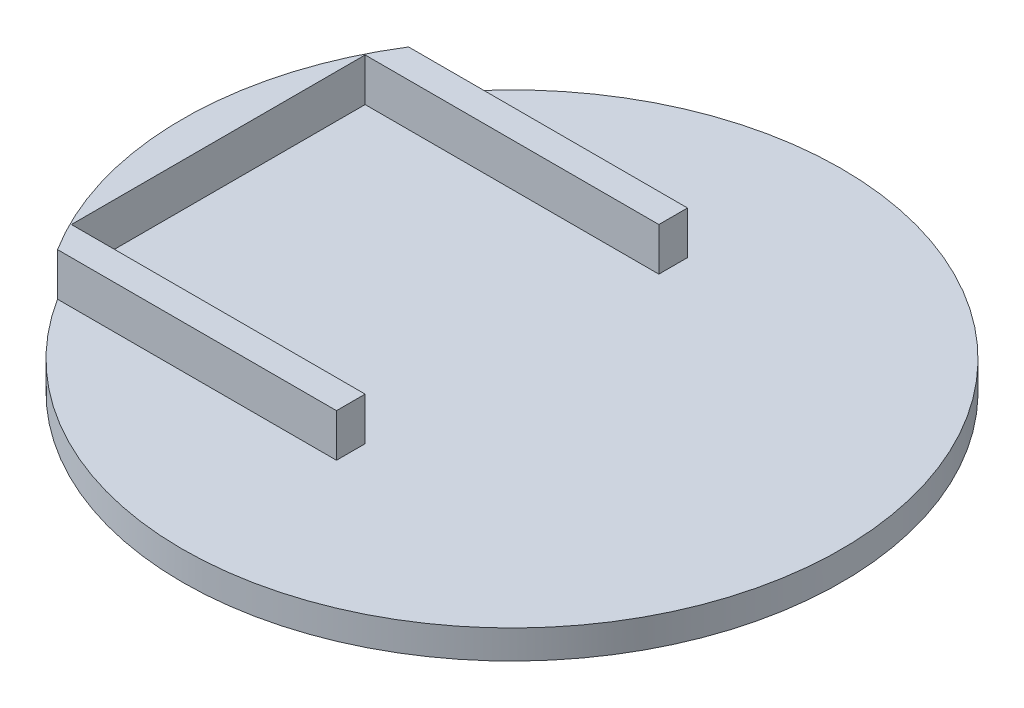
ISO-10303-21;
HEADER;
FILE_DESCRIPTION(('STEP AP214'),'2;1');
FILE_NAME('part.step','',(''),(''),'','','');
FILE_SCHEMA(('AUTOMOTIVE_DESIGN { 1 0 10303 214 1 1 1 1 }'));
ENDSEC;
DATA;
#1=APPLICATION_CONTEXT('core data for automotive mechanical design processes');
#2=APPLICATION_PROTOCOL_DEFINITION('international standard','automotive_design',2000,#1);
#3=PRODUCT_CONTEXT('',#1,'mechanical');
#4=PRODUCT('Part','Part','',(#3));
#5=PRODUCT_RELATED_PRODUCT_CATEGORY('part','',(#4));
#6=PRODUCT_DEFINITION_FORMATION('','',#4);
#7=PRODUCT_DEFINITION_CONTEXT('part definition',#1,'design');
#8=PRODUCT_DEFINITION('design','',#6,#7);
#9=PRODUCT_DEFINITION_SHAPE('','',#8);
#10=(LENGTH_UNIT() NAMED_UNIT(*) SI_UNIT(.MILLI.,.METRE.));
#11=(NAMED_UNIT(*) PLANE_ANGLE_UNIT() SI_UNIT($,.RADIAN.));
#12=(NAMED_UNIT(*) SI_UNIT($,.STERADIAN.) SOLID_ANGLE_UNIT());
#13=UNCERTAINTY_MEASURE_WITH_UNIT(LENGTH_MEASURE(1.E-05),#10,'distance_accuracy_value','');
#14=(GEOMETRIC_REPRESENTATION_CONTEXT(3) GLOBAL_UNCERTAINTY_ASSIGNED_CONTEXT((#13)) GLOBAL_UNIT_ASSIGNED_CONTEXT((#10,
#11,#12)) REPRESENTATION_CONTEXT('',''));
#15=CARTESIAN_POINT('',(0.,0.,0.));
#16=DIRECTION('',(0.,0.,1.));
#17=DIRECTION('',(1.,0.,0.));
#18=AXIS2_PLACEMENT_3D('',#15,#16,#17);
#19=CARTESIAN_POINT('',(0.,2.,0.));
#20=DIRECTION('',(0.,1.,0.));
#21=DIRECTION('',(0.,0.,1.));
#22=AXIS2_PLACEMENT_3D('',#19,#20,#21);
#23=PLANE('',#22);
#24=CARTESIAN_POINT('',(0.,2.,0.));
#25=DIRECTION('',(0.,1.,0.));
#26=DIRECTION('',(0.,0.,1.));
#27=AXIS2_PLACEMENT_3D('',#24,#25,#26);
#28=CIRCLE('',#27,23.);
#29=CARTESIAN_POINT('',(-19.4663170630708,2.,12.25));
#30=VERTEX_POINT('',#29);
#31=CARTESIAN_POINT('',(-19.4663170630708,2.,-12.25));
#32=VERTEX_POINT('',#31);
#33=EDGE_CURVE('E11',#30,#32,#28,.T.);
#34=ORIENTED_EDGE('',*,*,#33,.T.);
#35=DIRECTION('',(1.,0.,0.));
#36=VECTOR('',#35,1.);
#37=CARTESIAN_POINT('',(0.,2.,-12.25));
#38=LINE('',#37,#36);
#39=CARTESIAN_POINT('',(0.,2.,-12.25));
#40=VERTEX_POINT('',#39);
#41=EDGE_CURVE('E132',#32,#40,#38,.T.);
#42=ORIENTED_EDGE('',*,*,#41,.T.);
#43=DIRECTION('',(0.,0.,1.));
#44=VECTOR('',#43,1.);
#45=CARTESIAN_POINT('',(0.,2.,0.));
#46=LINE('',#45,#44);
#47=CARTESIAN_POINT('',(0.,2.,-10.25));
#48=VERTEX_POINT('',#47);
#49=EDGE_CURVE('E135',#40,#48,#46,.T.);
#50=ORIENTED_EDGE('',*,*,#49,.T.);
#51=DIRECTION('',(-1.,0.,0.));
#52=VECTOR('',#51,1.);
#53=CARTESIAN_POINT('',(0.,2.,-10.25));
#54=LINE('',#53,#52);
#55=CARTESIAN_POINT('',(-20.5,2.,-10.25));
#56=VERTEX_POINT('',#55);
#57=EDGE_CURVE('E138',#48,#56,#54,.T.);
#58=ORIENTED_EDGE('',*,*,#57,.T.);
#59=DIRECTION('',(0.,0.,1.));
#60=VECTOR('',#59,1.);
#61=CARTESIAN_POINT('',(-20.5,2.,0.));
#62=LINE('',#61,#60);
#63=CARTESIAN_POINT('',(-20.5,2.,10.25));
#64=VERTEX_POINT('',#63);
#65=EDGE_CURVE('E56',#56,#64,#62,.T.);
#66=ORIENTED_EDGE('',*,*,#65,.T.);
#67=DIRECTION('',(1.,0.,0.));
#68=VECTOR('',#67,1.);
#69=CARTESIAN_POINT('',(0.,2.,10.25));
#70=LINE('',#69,#68);
#71=CARTESIAN_POINT('',(0.,2.,10.25));
#72=VERTEX_POINT('',#71);
#73=EDGE_CURVE('E118',#64,#72,#70,.T.);
#74=ORIENTED_EDGE('',*,*,#73,.T.);
#75=DIRECTION('',(0.,0.,1.));
#76=VECTOR('',#75,1.);
#77=CARTESIAN_POINT('',(0.,2.,0.));
#78=LINE('',#77,#76);
#79=CARTESIAN_POINT('',(0.,2.,12.25));
#80=VERTEX_POINT('',#79);
#81=EDGE_CURVE('E121',#72,#80,#78,.T.);
#82=ORIENTED_EDGE('',*,*,#81,.T.);
#83=DIRECTION('',(-1.,0.,0.));
#84=VECTOR('',#83,1.);
#85=CARTESIAN_POINT('',(0.,2.,12.25));
#86=LINE('',#85,#84);
#87=EDGE_CURVE('E129',#80,#30,#86,.T.);
#88=ORIENTED_EDGE('',*,*,#87,.T.);
#89=EDGE_LOOP('',(#34,#42,#50,#58,#66,#74,#82,#88));
#90=FACE_BOUND('',#89,.T.);
#91=ADVANCED_FACE('F33',(#90),#23,.T.);
#92=CARTESIAN_POINT('',(0.,2.,0.));
#93=DIRECTION('',(0.,-1.,0.));
#94=DIRECTION('',(0.,0.,-1.));
#95=AXIS2_PLACEMENT_3D('',#92,#93,#94);
#96=CYLINDRICAL_SURFACE('',#95,23.);
#97=CARTESIAN_POINT('',(0.,0.,0.));
#98=DIRECTION('',(0.,1.,0.));
#99=DIRECTION('',(0.,0.,1.));
#100=AXIS2_PLACEMENT_3D('',#97,#98,#99);
#101=CIRCLE('',#100,23.);
#102=CARTESIAN_POINT('',(0.,0.,23.));
#103=VERTEX_POINT('',#102);
#104=EDGE_CURVE('E37',#103,#103,#101,.T.);
#105=ORIENTED_EDGE('',*,*,#104,.T.);
#106=EDGE_LOOP('',(#105));
#107=FACE_BOUND('',#106,.T.);
#108=DIRECTION('',(0.,-1.,0.));
#109=VECTOR('',#108,1.);
#110=CARTESIAN_POINT('',(-19.4663170630708,5.,-12.25));
#111=LINE('',#110,#109);
#112=CARTESIAN_POINT('',(-19.4663170630708,5.,-12.25));
#113=VERTEX_POINT('',#112);
#114=EDGE_CURVE('E180',#113,#32,#111,.T.);
#115=ORIENTED_EDGE('',*,*,#114,.T.);
#116=ORIENTED_EDGE('',*,*,#33,.F.);
#117=DIRECTION('',(0.,-1.,0.));
#118=VECTOR('',#117,1.);
#119=CARTESIAN_POINT('',(-19.4663170630708,5.,12.25));
#120=LINE('',#119,#118);
#121=CARTESIAN_POINT('',(-19.4663170630708,5.,12.25));
#122=VERTEX_POINT('',#121);
#123=EDGE_CURVE('E177',#122,#30,#120,.T.);
#124=ORIENTED_EDGE('',*,*,#123,.F.);
#125=CARTESIAN_POINT('',(0.,5.,0.));
#126=DIRECTION('',(0.,1.,0.));
#127=DIRECTION('',(0.,0.,1.));
#128=AXIS2_PLACEMENT_3D('',#125,#126,#127);
#129=CIRCLE('',#128,23.);
#130=EDGE_CURVE('E181',#113,#122,#129,.T.);
#131=ORIENTED_EDGE('',*,*,#130,.F.);
#132=EDGE_LOOP('',(#115,#116,#124,#131));
#133=FACE_BOUND('',#132,.T.);
#134=ADVANCED_FACE('F35',(#107,#133),#96,.T.);
#135=CARTESIAN_POINT('',(0.,0.,0.));
#136=DIRECTION('',(0.,1.,0.));
#137=DIRECTION('',(0.,0.,1.));
#138=AXIS2_PLACEMENT_3D('',#135,#136,#137);
#139=PLANE('',#138);
#140=ORIENTED_EDGE('',*,*,#104,.F.);
#141=EDGE_LOOP('',(#140));
#142=FACE_BOUND('',#141,.T.);
#143=CARTESIAN_POINT('',(0.,0.,0.));
#144=DIRECTION('',(0.,1.,0.));
#145=DIRECTION('',(0.,0.,1.));
#146=AXIS2_PLACEMENT_3D('',#143,#144,#145);
#147=CIRCLE('',#146,0.5);
#148=CARTESIAN_POINT('',(0.,0.,0.5));
#149=VERTEX_POINT('',#148);
#150=EDGE_CURVE('E141',#149,#149,#147,.T.);
#151=ORIENTED_EDGE('',*,*,#150,.T.);
#152=EDGE_LOOP('',(#151));
#153=FACE_BOUND('',#152,.T.);
#154=ADVANCED_FACE('F148',(#142,#153),#139,.F.);
#155=CARTESIAN_POINT('',(0.,1.,0.));
#156=DIRECTION('',(0.,-1.,0.));
#157=DIRECTION('',(0.,0.,-1.));
#158=AXIS2_PLACEMENT_3D('',#155,#156,#157);
#159=CYLINDRICAL_SURFACE('',#158,0.5);
#160=CARTESIAN_POINT('',(0.,1.,0.));
#161=DIRECTION('',(0.,1.,0.));
#162=DIRECTION('',(0.,0.,1.));
#163=AXIS2_PLACEMENT_3D('',#160,#161,#162);
#164=CIRCLE('',#163,0.5);
#165=CARTESIAN_POINT('',(0.,1.,0.5));
#166=VERTEX_POINT('',#165);
#167=EDGE_CURVE('E142',#166,#166,#164,.T.);
#168=ORIENTED_EDGE('',*,*,#167,.T.);
#169=EDGE_LOOP('',(#168));
#170=FACE_BOUND('',#169,.T.);
#171=ORIENTED_EDGE('',*,*,#150,.F.);
#172=EDGE_LOOP('',(#171));
#173=FACE_BOUND('',#172,.T.);
#174=ADVANCED_FACE('F150',(#170,#173),#159,.F.);
#175=CARTESIAN_POINT('',(0.,1.,0.));
#176=DIRECTION('',(0.,1.,0.));
#177=DIRECTION('',(0.,0.,1.));
#178=AXIS2_PLACEMENT_3D('',#175,#176,#177);
#179=PLANE('',#178);
#180=ORIENTED_EDGE('',*,*,#167,.F.);
#181=EDGE_LOOP('',(#180));
#182=FACE_BOUND('',#181,.T.);
#183=ADVANCED_FACE('F152',(#182),#179,.F.);
#184=CARTESIAN_POINT('',(-20.5,5.,-10.25));
#185=DIRECTION('',(-1.,0.,0.));
#186=DIRECTION('',(0.,0.,1.));
#187=AXIS2_PLACEMENT_3D('',#184,#185,#186);
#188=PLANE('',#187);
#189=ORIENTED_EDGE('',*,*,#65,.F.);
#190=DIRECTION('',(0.,-1.,0.));
#191=VECTOR('',#190,1.);
#192=CARTESIAN_POINT('',(-20.5,5.,-10.25));
#193=LINE('',#192,#191);
#194=CARTESIAN_POINT('',(-20.5,5.,-10.25));
#195=VERTEX_POINT('',#194);
#196=EDGE_CURVE('E103',#195,#56,#193,.T.);
#197=ORIENTED_EDGE('',*,*,#196,.F.);
#198=DIRECTION('',(0.,0.,-1.));
#199=VECTOR('',#198,1.);
#200=CARTESIAN_POINT('',(-20.5,5.,-10.25));
#201=LINE('',#200,#199);
#202=CARTESIAN_POINT('',(-20.5,5.,10.25));
#203=VERTEX_POINT('',#202);
#204=EDGE_CURVE('E110',#203,#195,#201,.T.);
#205=ORIENTED_EDGE('',*,*,#204,.F.);
#206=DIRECTION('',(0.,-1.,0.));
#207=VECTOR('',#206,1.);
#208=CARTESIAN_POINT('',(-20.5,5.,10.25));
#209=LINE('',#208,#207);
#210=EDGE_CURVE('E192',#203,#64,#209,.T.);
#211=ORIENTED_EDGE('',*,*,#210,.T.);
#212=EDGE_LOOP('',(#189,#197,#205,#211));
#213=FACE_BOUND('',#212,.T.);
#214=ADVANCED_FACE('F117',(#213),#188,.F.);
#215=CARTESIAN_POINT('',(0.,5.,-10.25));
#216=DIRECTION('',(0.,0.,-1.));
#217=DIRECTION('',(-1.,0.,0.));
#218=AXIS2_PLACEMENT_3D('',#215,#216,#217);
#219=PLANE('',#218);
#220=ORIENTED_EDGE('',*,*,#57,.F.);
#221=DIRECTION('',(0.,-1.,0.));
#222=VECTOR('',#221,1.);
#223=CARTESIAN_POINT('',(0.,5.,-10.25));
#224=LINE('',#223,#222);
#225=CARTESIAN_POINT('',(0.,5.,-10.25));
#226=VERTEX_POINT('',#225);
#227=EDGE_CURVE('E106',#226,#48,#224,.T.);
#228=ORIENTED_EDGE('',*,*,#227,.F.);
#229=DIRECTION('',(1.,0.,0.));
#230=VECTOR('',#229,1.);
#231=CARTESIAN_POINT('',(0.,5.,-10.25));
#232=LINE('',#231,#230);
#233=EDGE_CURVE('E100',#195,#226,#232,.T.);
#234=ORIENTED_EDGE('',*,*,#233,.F.);
#235=ORIENTED_EDGE('',*,*,#196,.T.);
#236=EDGE_LOOP('',(#220,#228,#234,#235));
#237=FACE_BOUND('',#236,.T.);
#238=ADVANCED_FACE('F102',(#237),#219,.F.);
#239=CARTESIAN_POINT('',(0.,5.,-10.25));
#240=DIRECTION('',(-1.,0.,0.));
#241=DIRECTION('',(0.,0.,1.));
#242=AXIS2_PLACEMENT_3D('',#239,#240,#241);
#243=PLANE('',#242);
#244=ORIENTED_EDGE('',*,*,#49,.F.);
#245=DIRECTION('',(0.,-1.,0.));
#246=VECTOR('',#245,1.);
#247=CARTESIAN_POINT('',(0.,5.,-12.25));
#248=LINE('',#247,#246);
#249=CARTESIAN_POINT('',(0.,5.,-12.25));
#250=VERTEX_POINT('',#249);
#251=EDGE_CURVE('E123',#250,#40,#248,.T.);
#252=ORIENTED_EDGE('',*,*,#251,.F.);
#253=DIRECTION('',(0.,0.,-1.));
#254=VECTOR('',#253,1.);
#255=CARTESIAN_POINT('',(0.,5.,-10.25));
#256=LINE('',#255,#254);
#257=EDGE_CURVE('E109',#226,#250,#256,.T.);
#258=ORIENTED_EDGE('',*,*,#257,.F.);
#259=ORIENTED_EDGE('',*,*,#227,.T.);
#260=EDGE_LOOP('',(#244,#252,#258,#259));
#261=FACE_BOUND('',#260,.T.);
#262=ADVANCED_FACE('F204',(#261),#243,.F.);
#263=CARTESIAN_POINT('',(0.,5.,-12.25));
#264=DIRECTION('',(0.,0.,1.));
#265=DIRECTION('',(1.,0.,0.));
#266=AXIS2_PLACEMENT_3D('',#263,#264,#265);
#267=PLANE('',#266);
#268=ORIENTED_EDGE('',*,*,#41,.F.);
#269=ORIENTED_EDGE('',*,*,#114,.F.);
#270=DIRECTION('',(-1.,0.,0.));
#271=VECTOR('',#270,1.);
#272=CARTESIAN_POINT('',(0.,5.,-12.25));
#273=LINE('',#272,#271);
#274=EDGE_CURVE('E200',#250,#113,#273,.T.);
#275=ORIENTED_EDGE('',*,*,#274,.F.);
#276=ORIENTED_EDGE('',*,*,#251,.T.);
#277=EDGE_LOOP('',(#268,#269,#275,#276));
#278=FACE_BOUND('',#277,.T.);
#279=ADVANCED_FACE('F205',(#278),#267,.F.);
#280=CARTESIAN_POINT('',(0.,5.,12.25));
#281=DIRECTION('',(0.,0.,-1.));
#282=DIRECTION('',(-1.,0.,0.));
#283=AXIS2_PLACEMENT_3D('',#280,#281,#282);
#284=PLANE('',#283);
#285=ORIENTED_EDGE('',*,*,#87,.F.);
#286=DIRECTION('',(0.,-1.,0.));
#287=VECTOR('',#286,1.);
#288=CARTESIAN_POINT('',(0.,5.,12.25));
#289=LINE('',#288,#287);
#290=CARTESIAN_POINT('',(0.,5.,12.25));
#291=VERTEX_POINT('',#290);
#292=EDGE_CURVE('E186',#291,#80,#289,.T.);
#293=ORIENTED_EDGE('',*,*,#292,.F.);
#294=DIRECTION('',(1.,0.,0.));
#295=VECTOR('',#294,1.);
#296=CARTESIAN_POINT('',(0.,5.,12.25));
#297=LINE('',#296,#295);
#298=EDGE_CURVE('E197',#122,#291,#297,.T.);
#299=ORIENTED_EDGE('',*,*,#298,.F.);
#300=ORIENTED_EDGE('',*,*,#123,.T.);
#301=EDGE_LOOP('',(#285,#293,#299,#300));
#302=FACE_BOUND('',#301,.T.);
#303=ADVANCED_FACE('F207',(#302),#284,.F.);
#304=CARTESIAN_POINT('',(0.,5.,10.25));
#305=DIRECTION('',(-1.,0.,0.));
#306=DIRECTION('',(0.,0.,1.));
#307=AXIS2_PLACEMENT_3D('',#304,#305,#306);
#308=PLANE('',#307);
#309=ORIENTED_EDGE('',*,*,#81,.F.);
#310=DIRECTION('',(0.,-1.,0.));
#311=VECTOR('',#310,1.);
#312=CARTESIAN_POINT('',(0.,5.,10.25));
#313=LINE('',#312,#311);
#314=CARTESIAN_POINT('',(0.,5.,10.25));
#315=VERTEX_POINT('',#314);
#316=EDGE_CURVE('E48',#315,#72,#313,.T.);
#317=ORIENTED_EDGE('',*,*,#316,.F.);
#318=DIRECTION('',(0.,0.,-1.));
#319=VECTOR('',#318,1.);
#320=CARTESIAN_POINT('',(0.,5.,10.25));
#321=LINE('',#320,#319);
#322=EDGE_CURVE('E195',#291,#315,#321,.T.);
#323=ORIENTED_EDGE('',*,*,#322,.F.);
#324=ORIENTED_EDGE('',*,*,#292,.T.);
#325=EDGE_LOOP('',(#309,#317,#323,#324));
#326=FACE_BOUND('',#325,.T.);
#327=ADVANCED_FACE('F213',(#326),#308,.F.);
#328=CARTESIAN_POINT('',(0.,5.,10.25));
#329=DIRECTION('',(0.,0.,1.));
#330=DIRECTION('',(1.,0.,0.));
#331=AXIS2_PLACEMENT_3D('',#328,#329,#330);
#332=PLANE('',#331);
#333=ORIENTED_EDGE('',*,*,#73,.F.);
#334=ORIENTED_EDGE('',*,*,#210,.F.);
#335=DIRECTION('',(-1.,0.,0.));
#336=VECTOR('',#335,1.);
#337=CARTESIAN_POINT('',(0.,5.,10.25));
#338=LINE('',#337,#336);
#339=EDGE_CURVE('E114',#315,#203,#338,.T.);
#340=ORIENTED_EDGE('',*,*,#339,.F.);
#341=ORIENTED_EDGE('',*,*,#316,.T.);
#342=EDGE_LOOP('',(#333,#334,#340,#341));
#343=FACE_BOUND('',#342,.T.);
#344=ADVANCED_FACE('F253',(#343),#332,.F.);
#345=CARTESIAN_POINT('',(0.,5.,0.));
#346=DIRECTION('',(0.,1.,0.));
#347=DIRECTION('',(0.,0.,1.));
#348=AXIS2_PLACEMENT_3D('',#345,#346,#347);
#349=PLANE('',#348);
#350=ORIENTED_EDGE('',*,*,#204,.T.);
#351=ORIENTED_EDGE('',*,*,#233,.T.);
#352=ORIENTED_EDGE('',*,*,#257,.T.);
#353=ORIENTED_EDGE('',*,*,#274,.T.);
#354=ORIENTED_EDGE('',*,*,#130,.T.);
#355=ORIENTED_EDGE('',*,*,#298,.T.);
#356=ORIENTED_EDGE('',*,*,#322,.T.);
#357=ORIENTED_EDGE('',*,*,#339,.T.);
#358=EDGE_LOOP('',(#350,#351,#352,#353,#354,#355,#356,#357));
#359=FACE_BOUND('',#358,.T.);
#360=ADVANCED_FACE('F113',(#359),#349,.T.);
#361=CLOSED_SHELL('',(#91,#134,#154,#174,#183,#214,#238,#262,#279,#303,#327,#344,#360));
#362=MANIFOLD_SOLID_BREP('B2',#361);
#363=ADVANCED_BREP_SHAPE_REPRESENTATION('',(#18,#362),#14);
#364=SHAPE_DEFINITION_REPRESENTATION(#9,#363);
ENDSEC;
END-ISO-10303-21;
